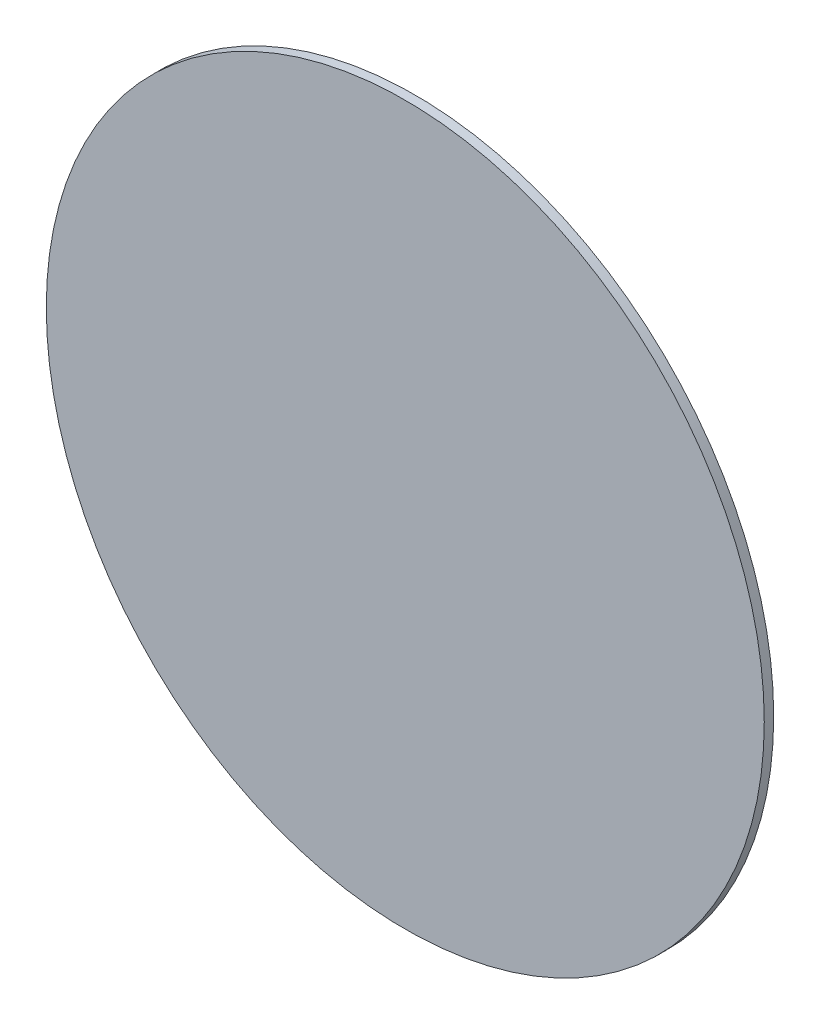
ISO-10303-21;
HEADER;
FILE_DESCRIPTION(('STEP AP214'),'2;1');
FILE_NAME('part.step','',(''),(''),'','','');
FILE_SCHEMA(('AUTOMOTIVE_DESIGN { 1 0 10303 214 1 1 1 1 }'));
ENDSEC;
DATA;
#1=APPLICATION_CONTEXT('core data for automotive mechanical design processes');
#2=APPLICATION_PROTOCOL_DEFINITION('international standard','automotive_design',2000,#1);
#3=PRODUCT_CONTEXT('',#1,'mechanical');
#4=PRODUCT('Part','Part','',(#3));
#5=PRODUCT_RELATED_PRODUCT_CATEGORY('part','',(#4));
#6=PRODUCT_DEFINITION_FORMATION('','',#4);
#7=PRODUCT_DEFINITION_CONTEXT('part definition',#1,'design');
#8=PRODUCT_DEFINITION('design','',#6,#7);
#9=PRODUCT_DEFINITION_SHAPE('','',#8);
#10=(LENGTH_UNIT() NAMED_UNIT(*) SI_UNIT(.MILLI.,.METRE.));
#11=(NAMED_UNIT(*) PLANE_ANGLE_UNIT() SI_UNIT($,.RADIAN.));
#12=(NAMED_UNIT(*) SI_UNIT($,.STERADIAN.) SOLID_ANGLE_UNIT());
#13=UNCERTAINTY_MEASURE_WITH_UNIT(LENGTH_MEASURE(1.E-05),#10,'distance_accuracy_value','');
#14=(GEOMETRIC_REPRESENTATION_CONTEXT(3) GLOBAL_UNCERTAINTY_ASSIGNED_CONTEXT((#13)) GLOBAL_UNIT_ASSIGNED_CONTEXT((#10,
#11,#12)) REPRESENTATION_CONTEXT('',''));
#15=CARTESIAN_POINT('',(0.,0.,0.));
#16=DIRECTION('',(0.,0.,1.));
#17=DIRECTION('',(1.,0.,0.));
#18=AXIS2_PLACEMENT_3D('',#15,#16,#17);
#19=CARTESIAN_POINT('',(0.,0.,5.));
#20=DIRECTION('',(0.,0.,-1.));
#21=DIRECTION('',(-1.,0.,0.));
#22=AXIS2_PLACEMENT_3D('',#19,#20,#21);
#23=CYLINDRICAL_SURFACE('',#22,190.);
#24=CARTESIAN_POINT('',(0.,0.,5.));
#25=DIRECTION('',(0.,0.,1.));
#26=DIRECTION('',(1.,0.,0.));
#27=AXIS2_PLACEMENT_3D('',#24,#25,#26);
#28=CIRCLE('',#27,190.);
#29=CARTESIAN_POINT('',(190.,0.,5.));
#30=VERTEX_POINT('',#29);
#31=EDGE_CURVE('E10',#30,#30,#28,.T.);
#32=ORIENTED_EDGE('',*,*,#31,.F.);
#33=EDGE_LOOP('',(#32));
#34=FACE_BOUND('',#33,.T.);
#35=CARTESIAN_POINT('',(0.,0.,0.));
#36=DIRECTION('',(0.,0.,1.));
#37=DIRECTION('',(1.,0.,0.));
#38=AXIS2_PLACEMENT_3D('',#35,#36,#37);
#39=CIRCLE('',#38,190.);
#40=CARTESIAN_POINT('',(190.,0.,0.));
#41=VERTEX_POINT('',#40);
#42=EDGE_CURVE('E34',#41,#41,#39,.T.);
#43=ORIENTED_EDGE('',*,*,#42,.T.);
#44=EDGE_LOOP('',(#43));
#45=FACE_BOUND('',#44,.T.);
#46=ADVANCED_FACE('F31',(#34,#45),#23,.T.);
#47=CARTESIAN_POINT('',(0.,0.,5.));
#48=DIRECTION('',(0.,0.,1.));
#49=DIRECTION('',(1.,0.,0.));
#50=AXIS2_PLACEMENT_3D('',#47,#48,#49);
#51=PLANE('',#50);
#52=ORIENTED_EDGE('',*,*,#31,.T.);
#53=EDGE_LOOP('',(#52));
#54=FACE_BOUND('',#53,.T.);
#55=ADVANCED_FACE('F46',(#54),#51,.T.);
#56=CARTESIAN_POINT('',(0.,0.,0.));
#57=DIRECTION('',(0.,0.,1.));
#58=DIRECTION('',(1.,0.,0.));
#59=AXIS2_PLACEMENT_3D('',#56,#57,#58);
#60=PLANE('',#59);
#61=ORIENTED_EDGE('',*,*,#42,.F.);
#62=EDGE_LOOP('',(#61));
#63=FACE_BOUND('',#62,.T.);
#64=ADVANCED_FACE('F44',(#63),#60,.F.);
#65=CLOSED_SHELL('',(#46,#55,#64));
#66=MANIFOLD_SOLID_BREP('B2',#65);
#67=ADVANCED_BREP_SHAPE_REPRESENTATION('',(#18,#66),#14);
#68=SHAPE_DEFINITION_REPRESENTATION(#9,#67);
ENDSEC;
END-ISO-10303-21;
